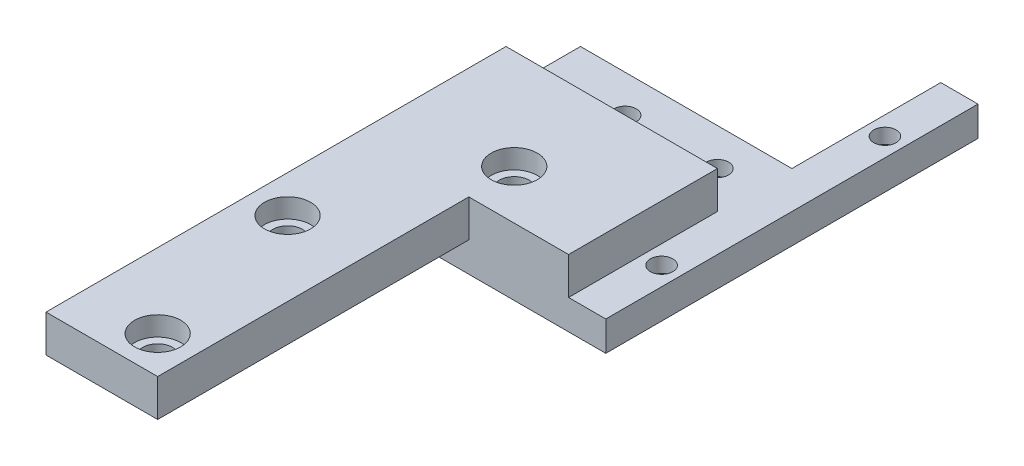
ISO-10303-21;
HEADER;
FILE_DESCRIPTION(('STEP AP214'),'2;1');
FILE_NAME('part.step','',(''),(''),'','','');
FILE_SCHEMA(('AUTOMOTIVE_DESIGN { 1 0 10303 214 1 1 1 1 }'));
ENDSEC;
DATA;
#1=APPLICATION_CONTEXT('core data for automotive mechanical design processes');
#2=APPLICATION_PROTOCOL_DEFINITION('international standard','automotive_design',2000,#1);
#3=PRODUCT_CONTEXT('',#1,'mechanical');
#4=PRODUCT('Part','Part','',(#3));
#5=PRODUCT_RELATED_PRODUCT_CATEGORY('part','',(#4));
#6=PRODUCT_DEFINITION_FORMATION('','',#4);
#7=PRODUCT_DEFINITION_CONTEXT('part definition',#1,'design');
#8=PRODUCT_DEFINITION('design','',#6,#7);
#9=PRODUCT_DEFINITION_SHAPE('','',#8);
#10=(LENGTH_UNIT() NAMED_UNIT(*) SI_UNIT(.MILLI.,.METRE.));
#11=(NAMED_UNIT(*) PLANE_ANGLE_UNIT() SI_UNIT($,.RADIAN.));
#12=(NAMED_UNIT(*) SI_UNIT($,.STERADIAN.) SOLID_ANGLE_UNIT());
#13=UNCERTAINTY_MEASURE_WITH_UNIT(LENGTH_MEASURE(1.E-05),#10,'distance_accuracy_value','');
#14=(GEOMETRIC_REPRESENTATION_CONTEXT(3) GLOBAL_UNCERTAINTY_ASSIGNED_CONTEXT((#13)) GLOBAL_UNIT_ASSIGNED_CONTEXT((#10,
#11,#12)) REPRESENTATION_CONTEXT('',''));
#15=CARTESIAN_POINT('',(0.,0.,0.));
#16=DIRECTION('',(0.,0.,1.));
#17=DIRECTION('',(1.,0.,0.));
#18=AXIS2_PLACEMENT_3D('',#15,#16,#17);
#19=CARTESIAN_POINT('',(2.5,-4.,9.99999999999999));
#20=DIRECTION('',(0.,1.,0.));
#21=DIRECTION('',(0.,0.,1.));
#22=AXIS2_PLACEMENT_3D('',#19,#20,#21);
#23=CYLINDRICAL_SURFACE('',#22,1.5);
#24=CARTESIAN_POINT('',(2.5,0.,9.99999999999999));
#25=DIRECTION('',(0.,-1.,0.));
#26=DIRECTION('',(0.,0.,-1.));
#27=AXIS2_PLACEMENT_3D('',#24,#25,#26);
#28=CIRCLE('',#27,1.5);
#29=CARTESIAN_POINT('',(2.5,0.,8.49999999999999));
#30=VERTEX_POINT('',#29);
#31=EDGE_CURVE('E293',#30,#30,#28,.T.);
#32=ORIENTED_EDGE('',*,*,#31,.F.);
#33=EDGE_LOOP('',(#32));
#34=FACE_BOUND('',#33,.T.);
#35=CARTESIAN_POINT('',(2.5,-2.,9.99999999999999));
#36=DIRECTION('',(0.,-1.,0.));
#37=DIRECTION('',(0.,0.,-1.));
#38=AXIS2_PLACEMENT_3D('',#35,#36,#37);
#39=CIRCLE('',#38,1.5);
#40=CARTESIAN_POINT('',(2.5,-2.,8.49999999999999));
#41=VERTEX_POINT('',#40);
#42=EDGE_CURVE('E63',#41,#41,#39,.T.);
#43=ORIENTED_EDGE('',*,*,#42,.T.);
#44=EDGE_LOOP('',(#43));
#45=FACE_BOUND('',#44,.T.);
#46=ADVANCED_FACE('F59',(#34,#45),#23,.F.);
#47=CARTESIAN_POINT('',(2.50000000000001,-4.,-20.));
#48=DIRECTION('',(0.,1.,0.));
#49=DIRECTION('',(0.,0.,1.));
#50=AXIS2_PLACEMENT_3D('',#47,#48,#49);
#51=CYLINDRICAL_SURFACE('',#50,1.5);
#52=CARTESIAN_POINT('',(2.50000000000001,0.,-20.));
#53=DIRECTION('',(0.,-1.,0.));
#54=DIRECTION('',(0.,0.,-1.));
#55=AXIS2_PLACEMENT_3D('',#52,#53,#54);
#56=CIRCLE('',#55,1.5);
#57=CARTESIAN_POINT('',(2.50000000000001,0.,-21.5));
#58=VERTEX_POINT('',#57);
#59=EDGE_CURVE('E297',#58,#58,#56,.T.);
#60=ORIENTED_EDGE('',*,*,#59,.F.);
#61=EDGE_LOOP('',(#60));
#62=FACE_BOUND('',#61,.T.);
#63=CARTESIAN_POINT('',(2.50000000000001,-2.,-20.));
#64=DIRECTION('',(0.,-1.,0.));
#65=DIRECTION('',(0.,0.,-1.));
#66=AXIS2_PLACEMENT_3D('',#63,#64,#65);
#67=CIRCLE('',#66,1.5);
#68=CARTESIAN_POINT('',(2.50000000000001,-2.,-21.5));
#69=VERTEX_POINT('',#68);
#70=EDGE_CURVE('E288',#69,#69,#67,.T.);
#71=ORIENTED_EDGE('',*,*,#70,.T.);
#72=EDGE_LOOP('',(#71));
#73=FACE_BOUND('',#72,.T.);
#74=ADVANCED_FACE('F339',(#62,#73),#51,.F.);
#75=CARTESIAN_POINT('',(-5.,-4.,-5.));
#76=DIRECTION('',(0.,1.,0.));
#77=DIRECTION('',(0.,0.,1.));
#78=AXIS2_PLACEMENT_3D('',#75,#76,#77);
#79=CYLINDRICAL_SURFACE('',#78,1.5);
#80=CARTESIAN_POINT('',(-5.,0.,-5.));
#81=DIRECTION('',(0.,-1.,0.));
#82=DIRECTION('',(0.,0.,-1.));
#83=AXIS2_PLACEMENT_3D('',#80,#81,#82);
#84=CIRCLE('',#83,1.5);
#85=CARTESIAN_POINT('',(-5.,0.,-6.5));
#86=VERTEX_POINT('',#85);
#87=EDGE_CURVE('E302',#86,#86,#84,.T.);
#88=ORIENTED_EDGE('',*,*,#87,.F.);
#89=EDGE_LOOP('',(#88));
#90=FACE_BOUND('',#89,.T.);
#91=CARTESIAN_POINT('',(-5.,-2.,-5.));
#92=DIRECTION('',(0.,-1.,0.));
#93=DIRECTION('',(0.,0.,-1.));
#94=AXIS2_PLACEMENT_3D('',#91,#92,#93);
#95=CIRCLE('',#94,1.5);
#96=CARTESIAN_POINT('',(-5.,-2.,-6.5));
#97=VERTEX_POINT('',#96);
#98=EDGE_CURVE('E285',#97,#97,#95,.T.);
#99=ORIENTED_EDGE('',*,*,#98,.T.);
#100=EDGE_LOOP('',(#99));
#101=FACE_BOUND('',#100,.T.);
#102=ADVANCED_FACE('F345',(#90,#101),#79,.F.);
#103=CARTESIAN_POINT('',(-17.4,-4.,-5.));
#104=DIRECTION('',(0.,1.,0.));
#105=DIRECTION('',(0.,0.,1.));
#106=AXIS2_PLACEMENT_3D('',#103,#104,#105);
#107=CYLINDRICAL_SURFACE('',#106,1.5);
#108=CARTESIAN_POINT('',(-17.4,0.,-5.));
#109=DIRECTION('',(0.,-1.,0.));
#110=DIRECTION('',(0.,0.,-1.));
#111=AXIS2_PLACEMENT_3D('',#108,#109,#110);
#112=CIRCLE('',#111,1.5);
#113=CARTESIAN_POINT('',(-17.4,0.,-6.5));
#114=VERTEX_POINT('',#113);
#115=EDGE_CURVE('E201',#114,#114,#112,.T.);
#116=ORIENTED_EDGE('',*,*,#115,.F.);
#117=EDGE_LOOP('',(#116));
#118=FACE_BOUND('',#117,.T.);
#119=CARTESIAN_POINT('',(-17.4,-2.,-5.));
#120=DIRECTION('',(0.,-1.,0.));
#121=DIRECTION('',(0.,0.,-1.));
#122=AXIS2_PLACEMENT_3D('',#119,#120,#121);
#123=CIRCLE('',#122,1.5);
#124=CARTESIAN_POINT('',(-17.4,-2.,-6.5));
#125=VERTEX_POINT('',#124);
#126=EDGE_CURVE('E282',#125,#125,#123,.T.);
#127=ORIENTED_EDGE('',*,*,#126,.T.);
#128=EDGE_LOOP('',(#127));
#129=FACE_BOUND('',#128,.T.);
#130=ADVANCED_FACE('F434',(#118,#129),#107,.F.);
#131=CARTESIAN_POINT('',(0.,5.,0.));
#132=DIRECTION('',(1.,0.,0.));
#133=DIRECTION('',(0.,0.,-1.));
#134=AXIS2_PLACEMENT_3D('',#131,#132,#133);
#135=PLANE('',#134);
#136=DIRECTION('',(0.,0.,1.));
#137=VECTOR('',#136,1.);
#138=CARTESIAN_POINT('',(0.,5.,0.));
#139=LINE('',#138,#137);
#140=CARTESIAN_POINT('',(0.,5.,0.));
#141=VERTEX_POINT('',#140);
#142=CARTESIAN_POINT('',(0.,5.,20.));
#143=VERTEX_POINT('',#142);
#144=EDGE_CURVE('E254',#141,#143,#139,.T.);
#145=ORIENTED_EDGE('',*,*,#144,.T.);
#146=DIRECTION('',(0.,-1.,0.));
#147=VECTOR('',#146,1.);
#148=CARTESIAN_POINT('',(0.,5.,20.));
#149=LINE('',#148,#147);
#150=CARTESIAN_POINT('',(0.,0.,20.));
#151=VERTEX_POINT('',#150);
#152=EDGE_CURVE('E221',#143,#151,#149,.T.);
#153=ORIENTED_EDGE('',*,*,#152,.T.);
#154=DIRECTION('',(0.,0.,1.));
#155=VECTOR('',#154,1.);
#156=CARTESIAN_POINT('',(0.,0.,0.));
#157=LINE('',#156,#155);
#158=CARTESIAN_POINT('',(0.,0.,0.));
#159=VERTEX_POINT('',#158);
#160=EDGE_CURVE('E237',#159,#151,#157,.T.);
#161=ORIENTED_EDGE('',*,*,#160,.F.);
#162=DIRECTION('',(0.,-1.,0.));
#163=VECTOR('',#162,1.);
#164=CARTESIAN_POINT('',(0.,5.,0.));
#165=LINE('',#164,#163);
#166=EDGE_CURVE('E68',#141,#159,#165,.T.);
#167=ORIENTED_EDGE('',*,*,#166,.F.);
#168=EDGE_LOOP('',(#145,#153,#161,#167));
#169=FACE_BOUND('',#168,.T.);
#170=ADVANCED_FACE('F61',(#169),#135,.T.);
#171=CARTESIAN_POINT('',(0.,5.,0.));
#172=DIRECTION('',(0.,0.,1.));
#173=DIRECTION('',(1.,0.,0.));
#174=AXIS2_PLACEMENT_3D('',#171,#172,#173);
#175=PLANE('',#174);
#176=DIRECTION('',(-1.,0.,0.));
#177=VECTOR('',#176,1.);
#178=CARTESIAN_POINT('',(0.,0.,0.));
#179=LINE('',#178,#177);
#180=CARTESIAN_POINT('',(-28.3999999999999,0.,0.));
#181=VERTEX_POINT('',#180);
#182=EDGE_CURVE('E256',#159,#181,#179,.T.);
#183=ORIENTED_EDGE('',*,*,#182,.T.);
#184=DIRECTION('',(0.,-1.,0.));
#185=VECTOR('',#184,1.);
#186=CARTESIAN_POINT('',(-28.3999999999999,5.,0.));
#187=LINE('',#186,#185);
#188=CARTESIAN_POINT('',(-28.3999999999999,5.,0.));
#189=VERTEX_POINT('',#188);
#190=EDGE_CURVE('E272',#189,#181,#187,.T.);
#191=ORIENTED_EDGE('',*,*,#190,.F.);
#192=DIRECTION('',(-1.,0.,0.));
#193=VECTOR('',#192,1.);
#194=CARTESIAN_POINT('',(0.,5.,0.));
#195=LINE('',#194,#193);
#196=EDGE_CURVE('E260',#141,#189,#195,.T.);
#197=ORIENTED_EDGE('',*,*,#196,.F.);
#198=ORIENTED_EDGE('',*,*,#166,.T.);
#199=EDGE_LOOP('',(#183,#191,#197,#198));
#200=FACE_BOUND('',#199,.T.);
#201=ADVANCED_FACE('F604',(#200),#175,.F.);
#202=CARTESIAN_POINT('',(-28.3999999999999,5.,0.));
#203=DIRECTION('',(1.,0.,0.));
#204=DIRECTION('',(0.,0.,-1.));
#205=AXIS2_PLACEMENT_3D('',#202,#203,#204);
#206=PLANE('',#205);
#207=ORIENTED_EDGE('',*,*,#190,.T.);
#208=DIRECTION('',(0.,0.,-1.));
#209=VECTOR('',#208,1.);
#210=CARTESIAN_POINT('',(-28.3999999999999,0.,19.9999999999999));
#211=LINE('',#210,#209);
#212=CARTESIAN_POINT('',(-28.3999999999999,0.,-10.));
#213=VERTEX_POINT('',#212);
#214=EDGE_CURVE('E181',#181,#213,#211,.T.);
#215=ORIENTED_EDGE('',*,*,#214,.T.);
#216=DIRECTION('',(0.,1.,0.));
#217=VECTOR('',#216,1.);
#218=CARTESIAN_POINT('',(-28.3999999999999,-4.,-10.));
#219=LINE('',#218,#217);
#220=CARTESIAN_POINT('',(-28.3999999999999,-4.,-10.));
#221=VERTEX_POINT('',#220);
#222=EDGE_CURVE('E162',#221,#213,#219,.T.);
#223=ORIENTED_EDGE('',*,*,#222,.F.);
#224=DIRECTION('',(0.,0.,-1.));
#225=VECTOR('',#224,1.);
#226=CARTESIAN_POINT('',(-28.3999999999999,-4.,19.9999999999999));
#227=LINE('',#226,#225);
#228=CARTESIAN_POINT('',(-28.3999999999999,-4.,19.9999999999999));
#229=VERTEX_POINT('',#228);
#230=EDGE_CURVE('E166',#229,#221,#227,.T.);
#231=ORIENTED_EDGE('',*,*,#230,.F.);
#232=DIRECTION('',(0.,1.,0.));
#233=VECTOR('',#232,1.);
#234=CARTESIAN_POINT('',(-28.3999999999999,-4.,19.9999999999999));
#235=LINE('',#234,#233);
#236=CARTESIAN_POINT('',(-28.3999999999999,0.,19.9999999999999));
#237=VERTEX_POINT('',#236);
#238=EDGE_CURVE('E183',#229,#237,#235,.T.);
#239=ORIENTED_EDGE('',*,*,#238,.T.);
#240=DIRECTION('',(0.,0.,1.));
#241=VECTOR('',#240,1.);
#242=CARTESIAN_POINT('',(-28.3999999999999,0.,0.));
#243=LINE('',#242,#241);
#244=CARTESIAN_POINT('',(-28.3999999999999,0.,61.7963043862971));
#245=VERTEX_POINT('',#244);
#246=EDGE_CURVE('E268',#237,#245,#243,.T.);
#247=ORIENTED_EDGE('',*,*,#246,.T.);
#248=DIRECTION('',(0.,-1.,0.));
#249=VECTOR('',#248,1.);
#250=CARTESIAN_POINT('',(-28.3999999999999,5.,61.7963043862971));
#251=LINE('',#250,#249);
#252=CARTESIAN_POINT('',(-28.3999999999999,5.,61.7963043862971));
#253=VERTEX_POINT('',#252);
#254=EDGE_CURVE('E262',#253,#245,#251,.T.);
#255=ORIENTED_EDGE('',*,*,#254,.F.);
#256=DIRECTION('',(0.,0.,1.));
#257=VECTOR('',#256,1.);
#258=CARTESIAN_POINT('',(-28.3999999999999,5.,0.));
#259=LINE('',#258,#257);
#260=EDGE_CURVE('E258',#189,#253,#259,.T.);
#261=ORIENTED_EDGE('',*,*,#260,.F.);
#262=EDGE_LOOP('',(#207,#215,#223,#231,#239,#247,#255,#261));
#263=FACE_BOUND('',#262,.T.);
#264=ADVANCED_FACE('F179',(#263),#206,.F.);
#265=CARTESIAN_POINT('',(0.,5.,61.7963043862971));
#266=DIRECTION('',(0.,0.,1.));
#267=DIRECTION('',(1.,0.,0.));
#268=AXIS2_PLACEMENT_3D('',#265,#266,#267);
#269=PLANE('',#268);
#270=DIRECTION('',(0.,-1.,0.));
#271=VECTOR('',#270,1.);
#272=CARTESIAN_POINT('',(-13.3999999999999,5.,61.7963043862971));
#273=LINE('',#272,#271);
#274=CARTESIAN_POINT('',(-13.3999999999999,5.,61.7963043862971));
#275=VERTEX_POINT('',#274);
#276=CARTESIAN_POINT('',(-13.3999999999999,0.,61.7963043862971));
#277=VERTEX_POINT('',#276);
#278=EDGE_CURVE('E223',#275,#277,#273,.T.);
#279=ORIENTED_EDGE('',*,*,#278,.F.);
#280=DIRECTION('',(-1.,0.,0.));
#281=VECTOR('',#280,1.);
#282=CARTESIAN_POINT('',(0.,5.,61.7963043862971));
#283=LINE('',#282,#281);
#284=EDGE_CURVE('E103',#275,#253,#283,.T.);
#285=ORIENTED_EDGE('',*,*,#284,.T.);
#286=ORIENTED_EDGE('',*,*,#254,.T.);
#287=DIRECTION('',(-1.,0.,0.));
#288=VECTOR('',#287,1.);
#289=CARTESIAN_POINT('',(0.,0.,61.7963043862971));
#290=LINE('',#289,#288);
#291=EDGE_CURVE('E265',#277,#245,#290,.T.);
#292=ORIENTED_EDGE('',*,*,#291,.F.);
#293=EDGE_LOOP('',(#279,#285,#286,#292));
#294=FACE_BOUND('',#293,.T.);
#295=ADVANCED_FACE('F603',(#294),#269,.T.);
#296=CARTESIAN_POINT('',(0.,5.,0.));
#297=DIRECTION('',(0.,-1.,0.));
#298=DIRECTION('',(0.,0.,-1.));
#299=AXIS2_PLACEMENT_3D('',#296,#297,#298);
#300=PLANE('',#299);
#301=CARTESIAN_POINT('',(-13.8999999999999,5.,13.4));
#302=DIRECTION('',(0.,-1.,0.));
#303=DIRECTION('',(0.,0.,-1.));
#304=AXIS2_PLACEMENT_3D('',#301,#302,#303);
#305=CIRCLE('',#304,3.1);
#306=CARTESIAN_POINT('',(-13.8999999999999,5.,10.3));
#307=VERTEX_POINT('',#306);
#308=EDGE_CURVE('E238',#307,#307,#305,.T.);
#309=ORIENTED_EDGE('',*,*,#308,.T.);
#310=EDGE_LOOP('',(#309));
#311=FACE_BOUND('',#310,.T.);
#312=CARTESIAN_POINT('',(-23.3999999999999,5.,34.3463600656534));
#313=DIRECTION('',(0.,-1.,0.));
#314=DIRECTION('',(0.,0.,-1.));
#315=AXIS2_PLACEMENT_3D('',#312,#313,#314);
#316=CIRCLE('',#315,3.1);
#317=CARTESIAN_POINT('',(-23.3999999999999,5.,31.2463600656534));
#318=VERTEX_POINT('',#317);
#319=EDGE_CURVE('E241',#318,#318,#316,.T.);
#320=ORIENTED_EDGE('',*,*,#319,.T.);
#321=EDGE_LOOP('',(#320));
#322=FACE_BOUND('',#321,.T.);
#323=CARTESIAN_POINT('',(-18.3999999999999,5.,56.7963043862971));
#324=DIRECTION('',(0.,-1.,0.));
#325=DIRECTION('',(0.,0.,-1.));
#326=AXIS2_PLACEMENT_3D('',#323,#324,#325);
#327=CIRCLE('',#326,3.1);
#328=CARTESIAN_POINT('',(-18.3999999999999,5.,53.6963043862971));
#329=VERTEX_POINT('',#328);
#330=EDGE_CURVE('E247',#329,#329,#327,.T.);
#331=ORIENTED_EDGE('',*,*,#330,.T.);
#332=EDGE_LOOP('',(#331));
#333=FACE_BOUND('',#332,.T.);
#334=ORIENTED_EDGE('',*,*,#284,.F.);
#335=DIRECTION('',(0.,0.,-1.));
#336=VECTOR('',#335,1.);
#337=CARTESIAN_POINT('',(-13.3999999999999,5.,0.));
#338=LINE('',#337,#336);
#339=CARTESIAN_POINT('',(-13.3999999999999,5.,20.));
#340=VERTEX_POINT('',#339);
#341=EDGE_CURVE('E211',#275,#340,#338,.T.);
#342=ORIENTED_EDGE('',*,*,#341,.T.);
#343=DIRECTION('',(-1.,0.,0.));
#344=VECTOR('',#343,1.);
#345=CARTESIAN_POINT('',(0.,5.,20.));
#346=LINE('',#345,#344);
#347=EDGE_CURVE('E214',#143,#340,#346,.T.);
#348=ORIENTED_EDGE('',*,*,#347,.F.);
#349=ORIENTED_EDGE('',*,*,#144,.F.);
#350=ORIENTED_EDGE('',*,*,#196,.T.);
#351=ORIENTED_EDGE('',*,*,#260,.T.);
#352=EDGE_LOOP('',(#334,#342,#348,#349,#350,#351));
#353=FACE_BOUND('',#352,.T.);
#354=ADVANCED_FACE('F591',(#311,#322,#333,#353),#300,.F.);
#355=CARTESIAN_POINT('',(0.,0.,0.));
#356=DIRECTION('',(0.,-1.,0.));
#357=DIRECTION('',(0.,0.,-1.));
#358=AXIS2_PLACEMENT_3D('',#355,#356,#357);
#359=PLANE('',#358);
#360=DIRECTION('',(-1.,0.,0.));
#361=VECTOR('',#360,1.);
#362=CARTESIAN_POINT('',(5.,0.,20.));
#363=LINE('',#362,#361);
#364=CARTESIAN_POINT('',(-13.3999999999999,0.,20.));
#365=VERTEX_POINT('',#364);
#366=EDGE_CURVE('E12',#365,#237,#363,.T.);
#367=ORIENTED_EDGE('',*,*,#366,.F.);
#368=DIRECTION('',(0.,0.,-1.));
#369=VECTOR('',#368,1.);
#370=CARTESIAN_POINT('',(-13.3999999999999,0.,0.));
#371=LINE('',#370,#369);
#372=EDGE_CURVE('E215',#277,#365,#371,.T.);
#373=ORIENTED_EDGE('',*,*,#372,.F.);
#374=ORIENTED_EDGE('',*,*,#291,.T.);
#375=ORIENTED_EDGE('',*,*,#246,.F.);
#376=EDGE_LOOP('',(#367,#373,#374,#375));
#377=FACE_BOUND('',#376,.T.);
#378=CARTESIAN_POINT('',(-23.3999999999999,0.,34.3463600656534));
#379=DIRECTION('',(0.,-1.,0.));
#380=DIRECTION('',(0.,0.,-1.));
#381=AXIS2_PLACEMENT_3D('',#378,#379,#380);
#382=CIRCLE('',#381,2.);
#383=CARTESIAN_POINT('',(-23.3999999999999,0.,32.3463600656534));
#384=VERTEX_POINT('',#383);
#385=EDGE_CURVE('E228',#384,#384,#382,.T.);
#386=ORIENTED_EDGE('',*,*,#385,.F.);
#387=EDGE_LOOP('',(#386));
#388=FACE_BOUND('',#387,.T.);
#389=CARTESIAN_POINT('',(-18.3999999999999,0.,56.7963043862971));
#390=DIRECTION('',(0.,-1.,0.));
#391=DIRECTION('',(0.,0.,-1.));
#392=AXIS2_PLACEMENT_3D('',#389,#390,#391);
#393=CIRCLE('',#392,2.);
#394=CARTESIAN_POINT('',(-18.3999999999999,0.,54.7963043862971));
#395=VERTEX_POINT('',#394);
#396=EDGE_CURVE('E225',#395,#395,#393,.T.);
#397=ORIENTED_EDGE('',*,*,#396,.F.);
#398=EDGE_LOOP('',(#397));
#399=FACE_BOUND('',#398,.T.);
#400=ADVANCED_FACE('F585',(#377,#388,#399),#359,.T.);
#401=CARTESIAN_POINT('',(-18.3999999999999,2.4,56.7963043862971));
#402=DIRECTION('',(0.,1.,0.));
#403=DIRECTION('',(0.,0.,1.));
#404=AXIS2_PLACEMENT_3D('',#401,#402,#403);
#405=CYLINDRICAL_SURFACE('',#404,3.1);
#406=CARTESIAN_POINT('',(-18.3999999999999,2.4,56.7963043862971));
#407=DIRECTION('',(0.,-1.,0.));
#408=DIRECTION('',(0.,0.,-1.));
#409=AXIS2_PLACEMENT_3D('',#406,#407,#408);
#410=CIRCLE('',#409,3.1);
#411=CARTESIAN_POINT('',(-18.3999999999999,2.4,53.6963043862971));
#412=VERTEX_POINT('',#411);
#413=EDGE_CURVE('E250',#412,#412,#410,.T.);
#414=ORIENTED_EDGE('',*,*,#413,.T.);
#415=EDGE_LOOP('',(#414));
#416=FACE_BOUND('',#415,.T.);
#417=ORIENTED_EDGE('',*,*,#330,.F.);
#418=EDGE_LOOP('',(#417));
#419=FACE_BOUND('',#418,.T.);
#420=ADVANCED_FACE('F590',(#416,#419),#405,.F.);
#421=CARTESIAN_POINT('',(-18.3999999999999,2.4,56.7963043862971));
#422=DIRECTION('',(0.,-1.,0.));
#423=DIRECTION('',(0.,0.,-1.));
#424=AXIS2_PLACEMENT_3D('',#421,#422,#423);
#425=PLANE('',#424);
#426=CARTESIAN_POINT('',(-18.3999999999999,2.4,56.7963043862971));
#427=DIRECTION('',(0.,-1.,0.));
#428=DIRECTION('',(0.,0.,-1.));
#429=AXIS2_PLACEMENT_3D('',#426,#427,#428);
#430=CIRCLE('',#429,2.);
#431=CARTESIAN_POINT('',(-18.3999999999999,2.4,54.7963043862971));
#432=VERTEX_POINT('',#431);
#433=EDGE_CURVE('E253',#432,#432,#430,.F.);
#434=ORIENTED_EDGE('',*,*,#433,.F.);
#435=EDGE_LOOP('',(#434));
#436=FACE_BOUND('',#435,.T.);
#437=ORIENTED_EDGE('',*,*,#413,.F.);
#438=EDGE_LOOP('',(#437));
#439=FACE_BOUND('',#438,.T.);
#440=ADVANCED_FACE('F692',(#436,#439),#425,.F.);
#441=CARTESIAN_POINT('',(-23.3999999999999,2.4,34.3463600656534));
#442=DIRECTION('',(0.,1.,0.));
#443=DIRECTION('',(0.,0.,1.));
#444=AXIS2_PLACEMENT_3D('',#441,#442,#443);
#445=CYLINDRICAL_SURFACE('',#444,3.1);
#446=CARTESIAN_POINT('',(-23.3999999999999,2.4,34.3463600656534));
#447=DIRECTION('',(0.,-1.,0.));
#448=DIRECTION('',(0.,0.,-1.));
#449=AXIS2_PLACEMENT_3D('',#446,#447,#448);
#450=CIRCLE('',#449,3.1);
#451=CARTESIAN_POINT('',(-23.3999999999999,2.4,31.2463600656534));
#452=VERTEX_POINT('',#451);
#453=EDGE_CURVE('E244',#452,#452,#450,.T.);
#454=ORIENTED_EDGE('',*,*,#453,.T.);
#455=EDGE_LOOP('',(#454));
#456=FACE_BOUND('',#455,.T.);
#457=ORIENTED_EDGE('',*,*,#319,.F.);
#458=EDGE_LOOP('',(#457));
#459=FACE_BOUND('',#458,.T.);
#460=ADVANCED_FACE('F684',(#456,#459),#445,.F.);
#461=CARTESIAN_POINT('',(-23.3999999999999,2.4,34.3463600656534));
#462=DIRECTION('',(0.,-1.,0.));
#463=DIRECTION('',(0.,0.,-1.));
#464=AXIS2_PLACEMENT_3D('',#461,#462,#463);
#465=PLANE('',#464);
#466=CARTESIAN_POINT('',(-23.3999999999999,2.4,34.3463600656534));
#467=DIRECTION('',(0.,-1.,0.));
#468=DIRECTION('',(0.,0.,-1.));
#469=AXIS2_PLACEMENT_3D('',#466,#467,#468);
#470=CIRCLE('',#469,2.);
#471=CARTESIAN_POINT('',(-23.3999999999999,2.4,32.3463600656534));
#472=VERTEX_POINT('',#471);
#473=EDGE_CURVE('E277',#472,#472,#470,.F.);
#474=ORIENTED_EDGE('',*,*,#473,.F.);
#475=EDGE_LOOP('',(#474));
#476=FACE_BOUND('',#475,.T.);
#477=ORIENTED_EDGE('',*,*,#453,.F.);
#478=EDGE_LOOP('',(#477));
#479=FACE_BOUND('',#478,.T.);
#480=ADVANCED_FACE('F679',(#476,#479),#465,.F.);
#481=CARTESIAN_POINT('',(-13.8999999999999,2.4,13.4));
#482=DIRECTION('',(0.,1.,0.));
#483=DIRECTION('',(0.,0.,1.));
#484=AXIS2_PLACEMENT_3D('',#481,#482,#483);
#485=CYLINDRICAL_SURFACE('',#484,3.1);
#486=CARTESIAN_POINT('',(-13.8999999999999,2.4,13.4));
#487=DIRECTION('',(0.,-1.,0.));
#488=DIRECTION('',(0.,0.,-1.));
#489=AXIS2_PLACEMENT_3D('',#486,#487,#488);
#490=CIRCLE('',#489,3.1);
#491=CARTESIAN_POINT('',(-13.8999999999999,2.4,10.3));
#492=VERTEX_POINT('',#491);
#493=EDGE_CURVE('E234',#492,#492,#490,.T.);
#494=ORIENTED_EDGE('',*,*,#493,.T.);
#495=EDGE_LOOP('',(#494));
#496=FACE_BOUND('',#495,.T.);
#497=ORIENTED_EDGE('',*,*,#308,.F.);
#498=EDGE_LOOP('',(#497));
#499=FACE_BOUND('',#498,.T.);
#500=ADVANCED_FACE('F671',(#496,#499),#485,.F.);
#501=CARTESIAN_POINT('',(-13.8999999999999,2.4,13.4));
#502=DIRECTION('',(0.,-1.,0.));
#503=DIRECTION('',(0.,0.,-1.));
#504=AXIS2_PLACEMENT_3D('',#501,#502,#503);
#505=PLANE('',#504);
#506=CARTESIAN_POINT('',(-13.8999999999999,2.4,13.4));
#507=DIRECTION('',(0.,-1.,0.));
#508=DIRECTION('',(0.,0.,-1.));
#509=AXIS2_PLACEMENT_3D('',#506,#507,#508);
#510=CIRCLE('',#509,2.);
#511=CARTESIAN_POINT('',(-13.8999999999999,2.4,11.4));
#512=VERTEX_POINT('',#511);
#513=EDGE_CURVE('E231',#512,#512,#510,.F.);
#514=ORIENTED_EDGE('',*,*,#513,.F.);
#515=EDGE_LOOP('',(#514));
#516=FACE_BOUND('',#515,.T.);
#517=ORIENTED_EDGE('',*,*,#493,.F.);
#518=EDGE_LOOP('',(#517));
#519=FACE_BOUND('',#518,.T.);
#520=ADVANCED_FACE('F661',(#516,#519),#505,.F.);
#521=CARTESIAN_POINT('',(-13.8999999999999,0.,13.4));
#522=DIRECTION('',(0.,1.,0.));
#523=DIRECTION('',(0.,0.,1.));
#524=AXIS2_PLACEMENT_3D('',#521,#522,#523);
#525=CYLINDRICAL_SURFACE('',#524,2.);
#526=CARTESIAN_POINT('',(-13.8999999999999,0.,13.4));
#527=DIRECTION('',(0.,-1.,0.));
#528=DIRECTION('',(0.,0.,-1.));
#529=AXIS2_PLACEMENT_3D('',#526,#527,#528);
#530=CIRCLE('',#529,2.);
#531=CARTESIAN_POINT('',(-13.8999999999999,0.,11.4));
#532=VERTEX_POINT('',#531);
#533=EDGE_CURVE('E205',#532,#532,#530,.T.);
#534=ORIENTED_EDGE('',*,*,#533,.T.);
#535=EDGE_LOOP('',(#534));
#536=FACE_BOUND('',#535,.T.);
#537=ORIENTED_EDGE('',*,*,#513,.T.);
#538=EDGE_LOOP('',(#537));
#539=FACE_BOUND('',#538,.T.);
#540=ADVANCED_FACE('F651',(#536,#539),#525,.F.);
#541=CARTESIAN_POINT('',(-23.3999999999999,0.,34.3463600656534));
#542=DIRECTION('',(0.,1.,0.));
#543=DIRECTION('',(0.,0.,1.));
#544=AXIS2_PLACEMENT_3D('',#541,#542,#543);
#545=CYLINDRICAL_SURFACE('',#544,2.);
#546=ORIENTED_EDGE('',*,*,#385,.T.);
#547=EDGE_LOOP('',(#546));
#548=FACE_BOUND('',#547,.T.);
#549=ORIENTED_EDGE('',*,*,#473,.T.);
#550=EDGE_LOOP('',(#549));
#551=FACE_BOUND('',#550,.T.);
#552=ADVANCED_FACE('F641',(#548,#551),#545,.F.);
#553=CARTESIAN_POINT('',(-18.3999999999999,0.,56.7963043862971));
#554=DIRECTION('',(0.,1.,0.));
#555=DIRECTION('',(0.,0.,1.));
#556=AXIS2_PLACEMENT_3D('',#553,#554,#555);
#557=CYLINDRICAL_SURFACE('',#556,2.);
#558=ORIENTED_EDGE('',*,*,#396,.T.);
#559=EDGE_LOOP('',(#558));
#560=FACE_BOUND('',#559,.T.);
#561=ORIENTED_EDGE('',*,*,#433,.T.);
#562=EDGE_LOOP('',(#561));
#563=FACE_BOUND('',#562,.T.);
#564=ADVANCED_FACE('F577',(#560,#563),#557,.F.);
#565=CARTESIAN_POINT('',(-13.3999999999999,5.,0.));
#566=DIRECTION('',(-1.,0.,0.));
#567=DIRECTION('',(0.,0.,1.));
#568=AXIS2_PLACEMENT_3D('',#565,#566,#567);
#569=PLANE('',#568);
#570=ORIENTED_EDGE('',*,*,#372,.T.);
#571=DIRECTION('',(0.,-1.,0.));
#572=VECTOR('',#571,1.);
#573=CARTESIAN_POINT('',(-13.3999999999999,5.,20.));
#574=LINE('',#573,#572);
#575=EDGE_CURVE('E217',#340,#365,#574,.T.);
#576=ORIENTED_EDGE('',*,*,#575,.F.);
#577=ORIENTED_EDGE('',*,*,#341,.F.);
#578=ORIENTED_EDGE('',*,*,#278,.T.);
#579=EDGE_LOOP('',(#570,#576,#577,#578));
#580=FACE_BOUND('',#579,.T.);
#581=ADVANCED_FACE('F335',(#580),#569,.F.);
#582=CARTESIAN_POINT('',(0.,5.,20.));
#583=DIRECTION('',(0.,0.,1.));
#584=DIRECTION('',(1.,0.,0.));
#585=AXIS2_PLACEMENT_3D('',#582,#583,#584);
#586=PLANE('',#585);
#587=ORIENTED_EDGE('',*,*,#575,.T.);
#588=ORIENTED_EDGE('',*,*,#366,.T.);
#589=ORIENTED_EDGE('',*,*,#238,.F.);
#590=DIRECTION('',(-1.,0.,0.));
#591=VECTOR('',#590,1.);
#592=CARTESIAN_POINT('',(5.,-4.,20.));
#593=LINE('',#592,#591);
#594=CARTESIAN_POINT('',(5.,-4.,20.));
#595=VERTEX_POINT('',#594);
#596=EDGE_CURVE('E173',#595,#229,#593,.T.);
#597=ORIENTED_EDGE('',*,*,#596,.F.);
#598=DIRECTION('',(0.,1.,0.));
#599=VECTOR('',#598,1.);
#600=CARTESIAN_POINT('',(5.,-4.,20.));
#601=LINE('',#600,#599);
#602=CARTESIAN_POINT('',(5.,0.,20.));
#603=VERTEX_POINT('',#602);
#604=EDGE_CURVE('E186',#595,#603,#601,.T.);
#605=ORIENTED_EDGE('',*,*,#604,.T.);
#606=EDGE_CURVE('E70',#603,#151,#363,.T.);
#607=ORIENTED_EDGE('',*,*,#606,.T.);
#608=ORIENTED_EDGE('',*,*,#152,.F.);
#609=ORIENTED_EDGE('',*,*,#347,.T.);
#610=EDGE_LOOP('',(#587,#588,#589,#597,#605,#607,#608,#609));
#611=FACE_BOUND('',#610,.T.);
#612=ADVANCED_FACE('F312',(#611),#586,.T.);
#613=CARTESIAN_POINT('',(0.,-4.,-10.));
#614=DIRECTION('',(1.,0.,0.));
#615=DIRECTION('',(0.,0.,-1.));
#616=AXIS2_PLACEMENT_3D('',#613,#614,#615);
#617=PLANE('',#616);
#618=DIRECTION('',(0.,0.,-1.));
#619=VECTOR('',#618,1.);
#620=CARTESIAN_POINT('',(0.,0.,-10.));
#621=LINE('',#620,#619);
#622=CARTESIAN_POINT('',(0.,0.,-10.));
#623=VERTEX_POINT('',#622);
#624=CARTESIAN_POINT('',(0.,0.,-30.));
#625=VERTEX_POINT('',#624);
#626=EDGE_CURVE('E195',#623,#625,#621,.T.);
#627=ORIENTED_EDGE('',*,*,#626,.T.);
#628=DIRECTION('',(0.,1.,0.));
#629=VECTOR('',#628,1.);
#630=CARTESIAN_POINT('',(0.,-4.,-30.));
#631=LINE('',#630,#629);
#632=CARTESIAN_POINT('',(0.,-4.,-30.));
#633=VERTEX_POINT('',#632);
#634=EDGE_CURVE('E206',#633,#625,#631,.T.);
#635=ORIENTED_EDGE('',*,*,#634,.F.);
#636=DIRECTION('',(0.,0.,-1.));
#637=VECTOR('',#636,1.);
#638=CARTESIAN_POINT('',(0.,-4.,-10.));
#639=LINE('',#638,#637);
#640=CARTESIAN_POINT('',(0.,-4.,-10.));
#641=VERTEX_POINT('',#640);
#642=EDGE_CURVE('E194',#641,#633,#639,.T.);
#643=ORIENTED_EDGE('',*,*,#642,.F.);
#644=DIRECTION('',(0.,1.,0.));
#645=VECTOR('',#644,1.);
#646=CARTESIAN_POINT('',(0.,-4.,-10.));
#647=LINE('',#646,#645);
#648=EDGE_CURVE('E163',#641,#623,#647,.T.);
#649=ORIENTED_EDGE('',*,*,#648,.T.);
#650=EDGE_LOOP('',(#627,#635,#643,#649));
#651=FACE_BOUND('',#650,.T.);
#652=ADVANCED_FACE('F327',(#651),#617,.F.);
#653=CARTESIAN_POINT('',(5.,-4.,-30.));
#654=DIRECTION('',(0.,0.,-1.));
#655=DIRECTION('',(-1.,0.,0.));
#656=AXIS2_PLACEMENT_3D('',#653,#654,#655);
#657=PLANE('',#656);
#658=DIRECTION('',(-1.,0.,0.));
#659=VECTOR('',#658,1.);
#660=CARTESIAN_POINT('',(5.,0.,-30.));
#661=LINE('',#660,#659);
#662=CARTESIAN_POINT('',(5.,0.,-30.));
#663=VERTEX_POINT('',#662);
#664=EDGE_CURVE('E198',#663,#625,#661,.T.);
#665=ORIENTED_EDGE('',*,*,#664,.F.);
#666=DIRECTION('',(0.,1.,0.));
#667=VECTOR('',#666,1.);
#668=CARTESIAN_POINT('',(5.,-4.,-30.));
#669=LINE('',#668,#667);
#670=CARTESIAN_POINT('',(5.,-4.,-30.));
#671=VERTEX_POINT('',#670);
#672=EDGE_CURVE('E197',#671,#663,#669,.T.);
#673=ORIENTED_EDGE('',*,*,#672,.F.);
#674=DIRECTION('',(-1.,0.,0.));
#675=VECTOR('',#674,1.);
#676=CARTESIAN_POINT('',(5.,-4.,-30.));
#677=LINE('',#676,#675);
#678=EDGE_CURVE('E191',#671,#633,#677,.T.);
#679=ORIENTED_EDGE('',*,*,#678,.T.);
#680=ORIENTED_EDGE('',*,*,#634,.T.);
#681=EDGE_LOOP('',(#665,#673,#679,#680));
#682=FACE_BOUND('',#681,.T.);
#683=ADVANCED_FACE('F323',(#682),#657,.T.);
#684=CARTESIAN_POINT('',(0.,-4.,0.));
#685=DIRECTION('',(0.,-1.,0.));
#686=DIRECTION('',(0.,0.,-1.));
#687=AXIS2_PLACEMENT_3D('',#684,#685,#686);
#688=PLANE('',#687);
#689=CARTESIAN_POINT('',(2.5,-4.,9.99999999999999));
#690=DIRECTION('',(0.,-1.,0.));
#691=DIRECTION('',(0.,0.,-1.));
#692=AXIS2_PLACEMENT_3D('',#689,#690,#691);
#693=CIRCLE('',#692,2.25);
#694=CARTESIAN_POINT('',(2.5,-4.,7.74999999999999));
#695=VERTEX_POINT('',#694);
#696=EDGE_CURVE('E394',#695,#695,#693,.T.);
#697=ORIENTED_EDGE('',*,*,#696,.F.);
#698=EDGE_LOOP('',(#697));
#699=FACE_BOUND('',#698,.T.);
#700=CARTESIAN_POINT('',(-5.,-4.,-5.));
#701=DIRECTION('',(0.,-1.,0.));
#702=DIRECTION('',(0.,0.,-1.));
#703=AXIS2_PLACEMENT_3D('',#700,#701,#702);
#704=CIRCLE('',#703,2.25);
#705=CARTESIAN_POINT('',(-5.,-4.,-7.25));
#706=VERTEX_POINT('',#705);
#707=EDGE_CURVE('E391',#706,#706,#704,.T.);
#708=ORIENTED_EDGE('',*,*,#707,.F.);
#709=EDGE_LOOP('',(#708));
#710=FACE_BOUND('',#709,.T.);
#711=CARTESIAN_POINT('',(-17.4,-4.,-5.));
#712=DIRECTION('',(0.,-1.,0.));
#713=DIRECTION('',(0.,0.,-1.));
#714=AXIS2_PLACEMENT_3D('',#711,#712,#713);
#715=CIRCLE('',#714,2.25);
#716=CARTESIAN_POINT('',(-17.4,-4.,-7.25));
#717=VERTEX_POINT('',#716);
#718=EDGE_CURVE('E385',#717,#717,#715,.T.);
#719=ORIENTED_EDGE('',*,*,#718,.F.);
#720=EDGE_LOOP('',(#719));
#721=FACE_BOUND('',#720,.T.);
#722=CARTESIAN_POINT('',(2.50000000000001,-4.,-20.));
#723=DIRECTION('',(0.,-1.,0.));
#724=DIRECTION('',(0.,0.,-1.));
#725=AXIS2_PLACEMENT_3D('',#722,#723,#724);
#726=CIRCLE('',#725,2.25);
#727=CARTESIAN_POINT('',(2.50000000000001,-4.,-22.25));
#728=VERTEX_POINT('',#727);
#729=EDGE_CURVE('E379',#728,#728,#726,.T.);
#730=ORIENTED_EDGE('',*,*,#729,.F.);
#731=EDGE_LOOP('',(#730));
#732=FACE_BOUND('',#731,.T.);
#733=DIRECTION('',(-1.,0.,0.));
#734=VECTOR('',#733,1.);
#735=CARTESIAN_POINT('',(5.,-4.,-10.));
#736=LINE('',#735,#734);
#737=EDGE_CURVE('E157',#641,#221,#736,.T.);
#738=ORIENTED_EDGE('',*,*,#737,.F.);
#739=ORIENTED_EDGE('',*,*,#642,.T.);
#740=ORIENTED_EDGE('',*,*,#678,.F.);
#741=DIRECTION('',(0.,0.,-1.));
#742=VECTOR('',#741,1.);
#743=CARTESIAN_POINT('',(5.,-4.,20.));
#744=LINE('',#743,#742);
#745=EDGE_CURVE('E184',#595,#671,#744,.T.);
#746=ORIENTED_EDGE('',*,*,#745,.F.);
#747=ORIENTED_EDGE('',*,*,#596,.T.);
#748=ORIENTED_EDGE('',*,*,#230,.T.);
#749=EDGE_LOOP('',(#738,#739,#740,#746,#747,#748));
#750=FACE_BOUND('',#749,.T.);
#751=ADVANCED_FACE('F170',(#699,#710,#721,#732,#750),#688,.T.);
#752=CARTESIAN_POINT('',(5.,-4.,20.));
#753=DIRECTION('',(1.,0.,0.));
#754=DIRECTION('',(0.,0.,-1.));
#755=AXIS2_PLACEMENT_3D('',#752,#753,#754);
#756=PLANE('',#755);
#757=DIRECTION('',(0.,0.,-1.));
#758=VECTOR('',#757,1.);
#759=CARTESIAN_POINT('',(5.,0.,20.));
#760=LINE('',#759,#758);
#761=EDGE_CURVE('E167',#603,#663,#760,.T.);
#762=ORIENTED_EDGE('',*,*,#761,.F.);
#763=ORIENTED_EDGE('',*,*,#604,.F.);
#764=ORIENTED_EDGE('',*,*,#745,.T.);
#765=ORIENTED_EDGE('',*,*,#672,.T.);
#766=EDGE_LOOP('',(#762,#763,#764,#765));
#767=FACE_BOUND('',#766,.T.);
#768=ADVANCED_FACE('F318',(#767),#756,.T.);
#769=CARTESIAN_POINT('',(5.,-4.,-10.));
#770=DIRECTION('',(0.,0.,-1.));
#771=DIRECTION('',(-1.,0.,0.));
#772=AXIS2_PLACEMENT_3D('',#769,#770,#771);
#773=PLANE('',#772);
#774=ORIENTED_EDGE('',*,*,#648,.F.);
#775=ORIENTED_EDGE('',*,*,#737,.T.);
#776=ORIENTED_EDGE('',*,*,#222,.T.);
#777=DIRECTION('',(-1.,0.,0.));
#778=VECTOR('',#777,1.);
#779=CARTESIAN_POINT('',(5.,0.,-10.));
#780=LINE('',#779,#778);
#781=EDGE_CURVE('E208',#623,#213,#780,.T.);
#782=ORIENTED_EDGE('',*,*,#781,.F.);
#783=EDGE_LOOP('',(#774,#775,#776,#782));
#784=FACE_BOUND('',#783,.T.);
#785=ADVANCED_FACE('F159',(#784),#773,.T.);
#786=CARTESIAN_POINT('',(0.,0.,0.));
#787=DIRECTION('',(0.,-1.,0.));
#788=DIRECTION('',(0.,0.,-1.));
#789=AXIS2_PLACEMENT_3D('',#786,#787,#788);
#790=PLANE('',#789);
#791=ORIENTED_EDGE('',*,*,#115,.T.);
#792=EDGE_LOOP('',(#791));
#793=FACE_BOUND('',#792,.T.);
#794=ORIENTED_EDGE('',*,*,#87,.T.);
#795=EDGE_LOOP('',(#794));
#796=FACE_BOUND('',#795,.T.);
#797=ORIENTED_EDGE('',*,*,#59,.T.);
#798=EDGE_LOOP('',(#797));
#799=FACE_BOUND('',#798,.T.);
#800=ORIENTED_EDGE('',*,*,#31,.T.);
#801=EDGE_LOOP('',(#800));
#802=FACE_BOUND('',#801,.T.);
#803=ORIENTED_EDGE('',*,*,#182,.F.);
#804=ORIENTED_EDGE('',*,*,#160,.T.);
#805=ORIENTED_EDGE('',*,*,#606,.F.);
#806=ORIENTED_EDGE('',*,*,#761,.T.);
#807=ORIENTED_EDGE('',*,*,#664,.T.);
#808=ORIENTED_EDGE('',*,*,#626,.F.);
#809=ORIENTED_EDGE('',*,*,#781,.T.);
#810=ORIENTED_EDGE('',*,*,#214,.F.);
#811=EDGE_LOOP('',(#803,#804,#805,#806,#807,#808,#809,#810));
#812=FACE_BOUND('',#811,.T.);
#813=ADVANCED_FACE('F317',(#793,#796,#799,#802,#812),#790,.F.);
#814=ORIENTED_EDGE('',*,*,#533,.F.);
#815=EDGE_LOOP('',(#814));
#816=FACE_BOUND('',#815,.T.);
#817=ADVANCED_FACE('F353',(#816),#790,.F.);
#818=CARTESIAN_POINT('',(-17.4,-2.,-5.));
#819=DIRECTION('',(0.,-1.,0.));
#820=DIRECTION('',(0.,0.,-1.));
#821=AXIS2_PLACEMENT_3D('',#818,#819,#820);
#822=CYLINDRICAL_SURFACE('',#821,2.25);
#823=CARTESIAN_POINT('',(-17.4,-2.,-5.));
#824=DIRECTION('',(0.,-1.,0.));
#825=DIRECTION('',(0.,0.,-1.));
#826=AXIS2_PLACEMENT_3D('',#823,#824,#825);
#827=CIRCLE('',#826,2.25);
#828=CARTESIAN_POINT('',(-17.4,-2.,-7.25));
#829=VERTEX_POINT('',#828);
#830=EDGE_CURVE('E382',#829,#829,#827,.T.);
#831=ORIENTED_EDGE('',*,*,#830,.F.);
#832=EDGE_LOOP('',(#831));
#833=FACE_BOUND('',#832,.T.);
#834=ORIENTED_EDGE('',*,*,#718,.T.);
#835=EDGE_LOOP('',(#834));
#836=FACE_BOUND('',#835,.T.);
#837=ADVANCED_FACE('F356',(#833,#836),#822,.F.);
#838=CARTESIAN_POINT('',(-17.4,-2.,-5.));
#839=DIRECTION('',(0.,-1.,0.));
#840=DIRECTION('',(0.,0.,-1.));
#841=AXIS2_PLACEMENT_3D('',#838,#839,#840);
#842=PLANE('',#841);
#843=ORIENTED_EDGE('',*,*,#126,.F.);
#844=EDGE_LOOP('',(#843));
#845=FACE_BOUND('',#844,.T.);
#846=ORIENTED_EDGE('',*,*,#830,.T.);
#847=EDGE_LOOP('',(#846));
#848=FACE_BOUND('',#847,.T.);
#849=ADVANCED_FACE('F431',(#845,#848),#842,.T.);
#850=CARTESIAN_POINT('',(-5.,-2.,-5.));
#851=DIRECTION('',(0.,-1.,0.));
#852=DIRECTION('',(0.,0.,-1.));
#853=AXIS2_PLACEMENT_3D('',#850,#851,#852);
#854=CYLINDRICAL_SURFACE('',#853,2.25);
#855=CARTESIAN_POINT('',(-5.,-2.,-5.));
#856=DIRECTION('',(0.,-1.,0.));
#857=DIRECTION('',(0.,0.,-1.));
#858=AXIS2_PLACEMENT_3D('',#855,#856,#857);
#859=CIRCLE('',#858,2.25);
#860=CARTESIAN_POINT('',(-5.,-2.,-7.25));
#861=VERTEX_POINT('',#860);
#862=EDGE_CURVE('E388',#861,#861,#859,.T.);
#863=ORIENTED_EDGE('',*,*,#862,.F.);
#864=EDGE_LOOP('',(#863));
#865=FACE_BOUND('',#864,.T.);
#866=ORIENTED_EDGE('',*,*,#707,.T.);
#867=EDGE_LOOP('',(#866));
#868=FACE_BOUND('',#867,.T.);
#869=ADVANCED_FACE('F426',(#865,#868),#854,.F.);
#870=CARTESIAN_POINT('',(-5.,-2.,-5.));
#871=DIRECTION('',(0.,-1.,0.));
#872=DIRECTION('',(0.,0.,-1.));
#873=AXIS2_PLACEMENT_3D('',#870,#871,#872);
#874=PLANE('',#873);
#875=ORIENTED_EDGE('',*,*,#98,.F.);
#876=EDGE_LOOP('',(#875));
#877=FACE_BOUND('',#876,.T.);
#878=ORIENTED_EDGE('',*,*,#862,.T.);
#879=EDGE_LOOP('',(#878));
#880=FACE_BOUND('',#879,.T.);
#881=ADVANCED_FACE('F417',(#877,#880),#874,.T.);
#882=CARTESIAN_POINT('',(2.50000000000001,-2.,-20.));
#883=DIRECTION('',(0.,-1.,0.));
#884=DIRECTION('',(0.,0.,-1.));
#885=AXIS2_PLACEMENT_3D('',#882,#883,#884);
#886=CYLINDRICAL_SURFACE('',#885,2.25);
#887=CARTESIAN_POINT('',(2.50000000000001,-2.,-20.));
#888=DIRECTION('',(0.,-1.,0.));
#889=DIRECTION('',(0.,0.,-1.));
#890=AXIS2_PLACEMENT_3D('',#887,#888,#889);
#891=CIRCLE('',#890,2.25);
#892=CARTESIAN_POINT('',(2.50000000000001,-2.,-22.25));
#893=VERTEX_POINT('',#892);
#894=EDGE_CURVE('E376',#893,#893,#891,.T.);
#895=ORIENTED_EDGE('',*,*,#894,.F.);
#896=EDGE_LOOP('',(#895));
#897=FACE_BOUND('',#896,.T.);
#898=ORIENTED_EDGE('',*,*,#729,.T.);
#899=EDGE_LOOP('',(#898));
#900=FACE_BOUND('',#899,.T.);
#901=ADVANCED_FACE('F415',(#897,#900),#886,.F.);
#902=CARTESIAN_POINT('',(2.50000000000001,-2.,-20.));
#903=DIRECTION('',(0.,-1.,0.));
#904=DIRECTION('',(0.,0.,-1.));
#905=AXIS2_PLACEMENT_3D('',#902,#903,#904);
#906=PLANE('',#905);
#907=ORIENTED_EDGE('',*,*,#70,.F.);
#908=EDGE_LOOP('',(#907));
#909=FACE_BOUND('',#908,.T.);
#910=ORIENTED_EDGE('',*,*,#894,.T.);
#911=EDGE_LOOP('',(#910));
#912=FACE_BOUND('',#911,.T.);
#913=ADVANCED_FACE('F405',(#909,#912),#906,.T.);
#914=CARTESIAN_POINT('',(2.5,-2.,9.99999999999999));
#915=DIRECTION('',(0.,-1.,0.));
#916=DIRECTION('',(0.,0.,-1.));
#917=AXIS2_PLACEMENT_3D('',#914,#915,#916);
#918=CYLINDRICAL_SURFACE('',#917,2.25);
#919=CARTESIAN_POINT('',(2.5,-2.,9.99999999999999));
#920=DIRECTION('',(0.,-1.,0.));
#921=DIRECTION('',(0.,0.,-1.));
#922=AXIS2_PLACEMENT_3D('',#919,#920,#921);
#923=CIRCLE('',#922,2.25);
#924=CARTESIAN_POINT('',(2.5,-2.,7.74999999999999));
#925=VERTEX_POINT('',#924);
#926=EDGE_CURVE('E286',#925,#925,#923,.T.);
#927=ORIENTED_EDGE('',*,*,#926,.F.);
#928=EDGE_LOOP('',(#927));
#929=FACE_BOUND('',#928,.T.);
#930=ORIENTED_EDGE('',*,*,#696,.T.);
#931=EDGE_LOOP('',(#930));
#932=FACE_BOUND('',#931,.T.);
#933=ADVANCED_FACE('F402',(#929,#932),#918,.F.);
#934=CARTESIAN_POINT('',(2.5,-2.,9.99999999999999));
#935=DIRECTION('',(0.,-1.,0.));
#936=DIRECTION('',(0.,0.,-1.));
#937=AXIS2_PLACEMENT_3D('',#934,#935,#936);
#938=PLANE('',#937);
#939=ORIENTED_EDGE('',*,*,#42,.F.);
#940=EDGE_LOOP('',(#939));
#941=FACE_BOUND('',#940,.T.);
#942=ORIENTED_EDGE('',*,*,#926,.T.);
#943=EDGE_LOOP('',(#942));
#944=FACE_BOUND('',#943,.T.);
#945=ADVANCED_FACE('F400',(#941,#944),#938,.T.);
#946=CLOSED_SHELL('',(#46,#74,#102,#130,#170,#201,#264,#295,#354,#400,#420,#440,#460,#480,#500,
#520,#540,#552,#564,#581,#612,#652,#683,#751,#768,#785,#813,#817,#837,#849,#869,#881,#901,#913,
#933,#945));
#947=MANIFOLD_SOLID_BREP('B2',#946);
#948=ADVANCED_BREP_SHAPE_REPRESENTATION('',(#18,#947),#14);
#949=SHAPE_DEFINITION_REPRESENTATION(#9,#948);
ENDSEC;
END-ISO-10303-21;
